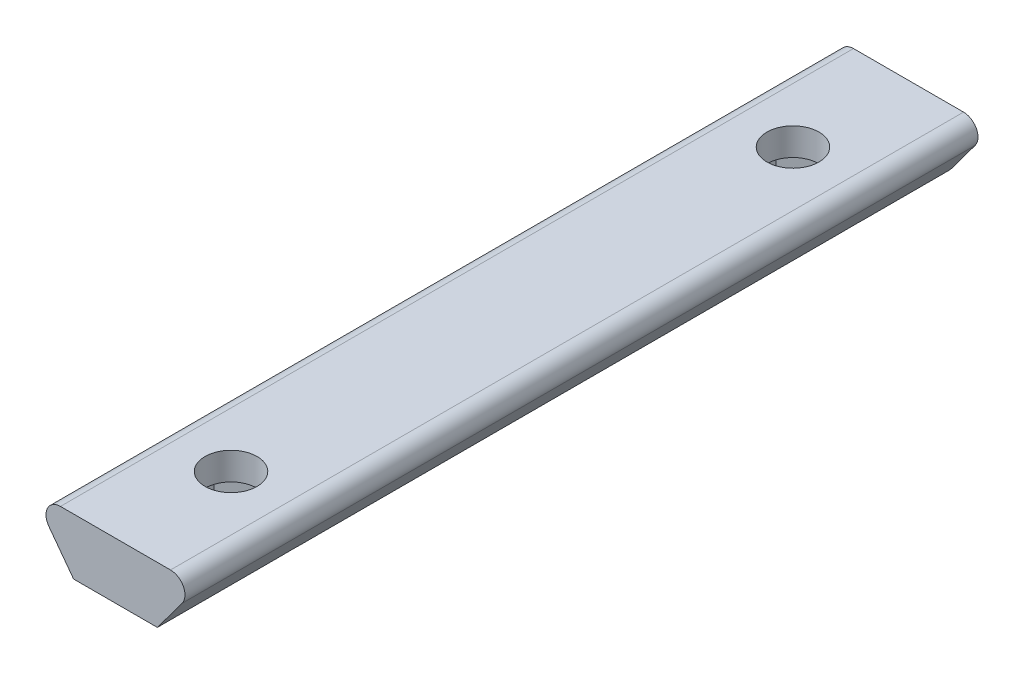
ISO-10303-21;
HEADER;
FILE_DESCRIPTION(('STEP AP214'),'2;1');
FILE_NAME('part.step','',(''),(''),'','','');
FILE_SCHEMA(('AUTOMOTIVE_DESIGN { 1 0 10303 214 1 1 1 1 }'));
ENDSEC;
DATA;
#1=APPLICATION_CONTEXT('core data for automotive mechanical design processes');
#2=APPLICATION_PROTOCOL_DEFINITION('international standard','automotive_design',2000,#1);
#3=PRODUCT_CONTEXT('',#1,'mechanical');
#4=PRODUCT('Part','Part','',(#3));
#5=PRODUCT_RELATED_PRODUCT_CATEGORY('part','',(#4));
#6=PRODUCT_DEFINITION_FORMATION('','',#4);
#7=PRODUCT_DEFINITION_CONTEXT('part definition',#1,'design');
#8=PRODUCT_DEFINITION('design','',#6,#7);
#9=PRODUCT_DEFINITION_SHAPE('','',#8);
#10=(LENGTH_UNIT() NAMED_UNIT(*) SI_UNIT(.MILLI.,.METRE.));
#11=(NAMED_UNIT(*) PLANE_ANGLE_UNIT() SI_UNIT($,.RADIAN.));
#12=(NAMED_UNIT(*) SI_UNIT($,.STERADIAN.) SOLID_ANGLE_UNIT());
#13=UNCERTAINTY_MEASURE_WITH_UNIT(LENGTH_MEASURE(1.E-05),#10,'distance_accuracy_value','');
#14=(GEOMETRIC_REPRESENTATION_CONTEXT(3) GLOBAL_UNCERTAINTY_ASSIGNED_CONTEXT((#13)) GLOBAL_UNIT_ASSIGNED_CONTEXT((#10,
#11,#12)) REPRESENTATION_CONTEXT('',''));
#15=CARTESIAN_POINT('',(0.,0.,0.));
#16=DIRECTION('',(0.,0.,1.));
#17=DIRECTION('',(1.,0.,0.));
#18=AXIS2_PLACEMENT_3D('',#15,#16,#17);
#19=CARTESIAN_POINT('',(0.,0.,54.9));
#20=DIRECTION('',(0.,1.,0.));
#21=DIRECTION('',(0.,0.,1.));
#22=AXIS2_PLACEMENT_3D('',#19,#20,#21);
#23=PLANE('',#22);
#24=DIRECTION('',(0.,0.,-1.));
#25=VECTOR('',#24,1.);
#26=CARTESIAN_POINT('',(0.,0.,54.9));
#27=LINE('',#26,#25);
#28=CARTESIAN_POINT('',(0.,0.,46.8828148717215));
#29=VERTEX_POINT('',#28);
#30=CARTESIAN_POINT('',(0.,0.,9.65148040349298));
#31=VERTEX_POINT('',#30);
#32=EDGE_CURVE('E334',#29,#31,#27,.T.);
#33=ORIENTED_EDGE('',*,*,#32,.T.);
#34=DIRECTION('',(-0.860038884376973,0.,-0.510228495244643));
#35=VECTOR('',#34,1.);
#36=CARTESIAN_POINT('',(2.86031403987544,0.,11.3483963860186));
#37=LINE('',#36,#35);
#38=CARTESIAN_POINT('',(2.86031403987544,0.,11.3483963860186));
#39=VERTEX_POINT('',#38);
#40=EDGE_CURVE('E210',#39,#31,#37,.T.);
#41=ORIENTED_EDGE('',*,*,#40,.F.);
#42=DIRECTION('',(-0.871890280805055,0.,0.489701274490564));
#43=VECTOR('',#42,1.);
#44=CARTESIAN_POINT('',(5.77995335216983,0.,9.70856724265073));
#45=LINE('',#44,#43);
#46=CARTESIAN_POINT('',(5.77995335216983,0.,9.70856724265073));
#47=VERTEX_POINT('',#46);
#48=EDGE_CURVE('E224',#47,#39,#45,.T.);
#49=ORIENTED_EDGE('',*,*,#48,.F.);
#50=DIRECTION('',(-0.0118513964280827,0.,0.999929769735207));
#51=VECTOR('',#50,1.);
#52=CARTESIAN_POINT('',(5.81963931229438,0.,6.36017085663215));
#53=LINE('',#52,#51);
#54=CARTESIAN_POINT('',(5.79999999999996,0.,8.0171851282863));
#55=VERTEX_POINT('',#54);
#56=EDGE_CURVE('E222',#55,#47,#53,.T.);
#57=ORIENTED_EDGE('',*,*,#56,.F.);
#58=DIRECTION('',(0.,0.,-1.));
#59=VECTOR('',#58,1.);
#60=CARTESIAN_POINT('',(5.8,0.,54.9));
#61=LINE('',#60,#59);
#62=CARTESIAN_POINT('',(5.8,0.,45.248519596507));
#63=VERTEX_POINT('',#62);
#64=EDGE_CURVE('E329',#63,#55,#61,.T.);
#65=ORIENTED_EDGE('',*,*,#64,.F.);
#66=DIRECTION('',(0.860038884376972,0.,0.510228495244643));
#67=VECTOR('',#66,1.);
#68=CARTESIAN_POINT('',(2.93968596012455,0.,43.5516036139814));
#69=LINE('',#68,#67);
#70=CARTESIAN_POINT('',(2.93968596012455,0.,43.5516036139814));
#71=VERTEX_POINT('',#70);
#72=EDGE_CURVE('E57',#71,#63,#69,.T.);
#73=ORIENTED_EDGE('',*,*,#72,.F.);
#74=DIRECTION('',(0.871890280805054,0.,-0.489701274490565));
#75=VECTOR('',#74,1.);
#76=CARTESIAN_POINT('',(0.0200466478301792,0.,45.1914327573493));
#77=LINE('',#76,#75);
#78=CARTESIAN_POINT('',(0.0200466478301792,0.,45.1914327573493));
#79=VERTEX_POINT('',#78);
#80=EDGE_CURVE('E267',#79,#71,#77,.T.);
#81=ORIENTED_EDGE('',*,*,#80,.F.);
#82=DIRECTION('',(0.0118513964280826,0.,-0.999929769735207));
#83=VECTOR('',#82,1.);
#84=CARTESIAN_POINT('',(-0.0196393122943744,0.,48.5398291433679));
#85=LINE('',#84,#83);
#86=EDGE_CURVE('E251',#29,#79,#85,.T.);
#87=ORIENTED_EDGE('',*,*,#86,.F.);
#88=EDGE_LOOP('',(#33,#41,#49,#57,#65,#73,#81,#87));
#89=FACE_BOUND('',#88,.T.);
#90=ADVANCED_FACE('F34',(#89),#23,.F.);
#91=CARTESIAN_POINT('',(2.9,200.,8.));
#92=DIRECTION('',(0.,-1.,0.));
#93=DIRECTION('',(0.,0.,-1.));
#94=AXIS2_PLACEMENT_3D('',#91,#92,#93);
#95=CYLINDRICAL_SURFACE('',#94,1.8);
#96=CARTESIAN_POINT('',(2.9,3.89999999999999,8.));
#97=DIRECTION('',(0.,-1.,0.));
#98=DIRECTION('',(0.,0.,-1.));
#99=AXIS2_PLACEMENT_3D('',#96,#97,#98);
#100=CIRCLE('',#99,1.8);
#101=CARTESIAN_POINT('',(2.9,3.89999999999999,6.2));
#102=VERTEX_POINT('',#101);
#103=EDGE_CURVE('E246',#102,#102,#100,.T.);
#104=ORIENTED_EDGE('',*,*,#103,.F.);
#105=EDGE_LOOP('',(#104));
#106=FACE_BOUND('',#105,.T.);
#107=CARTESIAN_POINT('',(2.9,2.,8.));
#108=DIRECTION('',(0.,-1.,0.));
#109=DIRECTION('',(0.,0.,-1.));
#110=AXIS2_PLACEMENT_3D('',#107,#108,#109);
#111=CIRCLE('',#110,1.8);
#112=CARTESIAN_POINT('',(2.9,2.,6.2));
#113=VERTEX_POINT('',#112);
#114=EDGE_CURVE('E230',#113,#113,#111,.F.);
#115=ORIENTED_EDGE('',*,*,#114,.F.);
#116=EDGE_LOOP('',(#115));
#117=FACE_BOUND('',#116,.T.);
#118=ADVANCED_FACE('F407',(#106,#117),#95,.F.);
#119=CARTESIAN_POINT('',(0.,0.,54.9));
#120=VERTEX_POINT('',#119);
#121=CARTESIAN_POINT('',(0.,0.,48.551480403493));
#122=VERTEX_POINT('',#121);
#123=EDGE_CURVE('E330',#120,#122,#27,.T.);
#124=ORIENTED_EDGE('',*,*,#123,.T.);
#125=DIRECTION('',(-0.860038884376973,0.,-0.510228495244643));
#126=VECTOR('',#125,1.);
#127=CARTESIAN_POINT('',(2.86031403987544,0.,50.2483963860186));
#128=LINE('',#127,#126);
#129=CARTESIAN_POINT('',(2.86031403987544,0.,50.2483963860186));
#130=VERTEX_POINT('',#129);
#131=EDGE_CURVE('E276',#130,#122,#128,.T.);
#132=ORIENTED_EDGE('',*,*,#131,.F.);
#133=DIRECTION('',(-0.871890280805055,0.,0.489701274490564));
#134=VECTOR('',#133,1.);
#135=CARTESIAN_POINT('',(5.77995335216983,0.,48.6085672426507));
#136=LINE('',#135,#134);
#137=CARTESIAN_POINT('',(5.77995335216983,0.,48.6085672426507));
#138=VERTEX_POINT('',#137);
#139=EDGE_CURVE('E273',#138,#130,#136,.T.);
#140=ORIENTED_EDGE('',*,*,#139,.F.);
#141=DIRECTION('',(-0.0118513964280827,0.,0.999929769735207));
#142=VECTOR('',#141,1.);
#143=CARTESIAN_POINT('',(5.81963931229438,0.,45.2601708566321));
#144=LINE('',#143,#142);
#145=CARTESIAN_POINT('',(5.80000000000003,0.,46.917185128274));
#146=VERTEX_POINT('',#145);
#147=EDGE_CURVE('E271',#146,#138,#144,.T.);
#148=ORIENTED_EDGE('',*,*,#147,.F.);
#149=CARTESIAN_POINT('',(5.8,0.,54.9));
#150=VERTEX_POINT('',#149);
#151=EDGE_CURVE('E325',#150,#146,#61,.T.);
#152=ORIENTED_EDGE('',*,*,#151,.F.);
#153=DIRECTION('',(1.,0.,0.));
#154=VECTOR('',#153,1.);
#155=CARTESIAN_POINT('',(0.,0.,54.9));
#156=LINE('',#155,#154);
#157=EDGE_CURVE('E304',#120,#150,#156,.T.);
#158=ORIENTED_EDGE('',*,*,#157,.F.);
#159=EDGE_LOOP('',(#124,#132,#140,#148,#152,#158));
#160=FACE_BOUND('',#159,.T.);
#161=ADVANCED_FACE('F409',(#160),#23,.F.);
#162=CARTESIAN_POINT('',(2.9,200.,46.9));
#163=DIRECTION('',(0.,-1.,0.));
#164=DIRECTION('',(0.,0.,-1.));
#165=AXIS2_PLACEMENT_3D('',#162,#163,#164);
#166=CYLINDRICAL_SURFACE('',#165,1.8);
#167=CARTESIAN_POINT('',(2.9,3.89999999999999,46.9));
#168=DIRECTION('',(0.,-1.,0.));
#169=DIRECTION('',(0.,0.,-1.));
#170=AXIS2_PLACEMENT_3D('',#167,#168,#169);
#171=CIRCLE('',#170,1.8);
#172=CARTESIAN_POINT('',(2.9,3.89999999999999,45.1));
#173=VERTEX_POINT('',#172);
#174=EDGE_CURVE('E301',#173,#173,#171,.T.);
#175=ORIENTED_EDGE('',*,*,#174,.F.);
#176=EDGE_LOOP('',(#175));
#177=FACE_BOUND('',#176,.T.);
#178=CARTESIAN_POINT('',(2.9,2.,46.9));
#179=DIRECTION('',(0.,-1.,0.));
#180=DIRECTION('',(0.,0.,-1.));
#181=AXIS2_PLACEMENT_3D('',#178,#179,#180);
#182=CIRCLE('',#181,1.8);
#183=CARTESIAN_POINT('',(2.9,2.,45.1));
#184=VERTEX_POINT('',#183);
#185=EDGE_CURVE('E282',#184,#184,#182,.F.);
#186=ORIENTED_EDGE('',*,*,#185,.F.);
#187=EDGE_LOOP('',(#186));
#188=FACE_BOUND('',#187,.T.);
#189=ADVANCED_FACE('F418',(#177,#188),#166,.F.);
#190=CARTESIAN_POINT('',(0.,0.,54.9));
#191=DIRECTION('',(0.802462340946133,0.596702766344561,0.));
#192=DIRECTION('',(-0.596702766344561,0.802462340946133,0.));
#193=AXIS2_PLACEMENT_3D('',#190,#191,#192);
#194=PLANE('',#193);
#195=CARTESIAN_POINT('',(0.,0.,7.98281487172149));
#196=VERTEX_POINT('',#195);
#197=CARTESIAN_POINT('',(0.,0.,0.));
#198=VERTEX_POINT('',#197);
#199=EDGE_CURVE('E328',#196,#198,#27,.T.);
#200=ORIENTED_EDGE('',*,*,#199,.F.);
#201=DIRECTION('',(-0.0118498914538362,0.0159360609206763,0.99980279157185));
#202=VECTOR('',#201,1.);
#203=CARTESIAN_POINT('',(-0.555853910391621,0.747527672595628,54.8814968959992));
#204=LINE('',#203,#202);
#205=CARTESIAN_POINT('',(-0.0196393122943727,0.026411488947599,9.63982914336786));
#206=VERTEX_POINT('',#205);
#207=EDGE_CURVE('E243',#196,#206,#204,.T.);
#208=ORIENTED_EDGE('',*,*,#207,.T.);
#209=DIRECTION('',(0.562497565518592,-0.756462243283624,0.333708500449065));
#210=VECTOR('',#209,1.);
#211=CARTESIAN_POINT('',(8.49360952720551,-11.4224403986557,14.6904172317982));
#212=LINE('',#211,#210);
#213=EDGE_CURVE('E240',#206,#31,#212,.T.);
#214=ORIENTED_EDGE('',*,*,#213,.T.);
#215=ORIENTED_EDGE('',*,*,#32,.F.);
#216=DIRECTION('',(-0.0118498914538362,0.0159360609206763,0.99980279157185));
#217=VECTOR('',#216,1.);
#218=CARTESIAN_POINT('',(-0.0949840381877716,0.127737154804245,54.896838198843));
#219=LINE('',#218,#217);
#220=CARTESIAN_POINT('',(-0.0196393122943739,0.0264114889476051,48.5398291433679));
#221=VERTEX_POINT('',#220);
#222=EDGE_CURVE('E298',#29,#221,#219,.T.);
#223=ORIENTED_EDGE('',*,*,#222,.T.);
#224=DIRECTION('',(0.562497565518592,-0.756462243283624,0.333708500449065));
#225=VECTOR('',#224,1.);
#226=CARTESIAN_POINT('',(1.19168200439215,-1.60260683349289,49.2584602005188));
#227=LINE('',#226,#225);
#228=EDGE_CURVE('E295',#221,#122,#227,.T.);
#229=ORIENTED_EDGE('',*,*,#228,.T.);
#230=ORIENTED_EDGE('',*,*,#123,.F.);
#231=DIRECTION('',(0.596702766344561,-0.802462340946133,0.));
#232=VECTOR('',#231,1.);
#233=CARTESIAN_POINT('',(0.,0.,54.9));
#234=LINE('',#233,#232);
#235=CARTESIAN_POINT('',(-1.71270819938481,2.30329723365544,54.9));
#236=VERTEX_POINT('',#235);
#237=EDGE_CURVE('E302',#236,#120,#234,.T.);
#238=ORIENTED_EDGE('',*,*,#237,.F.);
#239=DIRECTION('',(0.,0.,-1.));
#240=VECTOR('',#239,1.);
#241=CARTESIAN_POINT('',(-1.71270819938481,2.30329723365544,54.9));
#242=LINE('',#241,#240);
#243=CARTESIAN_POINT('',(-1.71270819938481,2.30329723365544,0.));
#244=VERTEX_POINT('',#243);
#245=EDGE_CURVE('E333',#236,#244,#242,.T.);
#246=ORIENTED_EDGE('',*,*,#245,.T.);
#247=DIRECTION('',(0.596702766344561,-0.802462340946133,0.));
#248=VECTOR('',#247,1.);
#249=CARTESIAN_POINT('',(0.,0.,0.));
#250=LINE('',#249,#248);
#251=EDGE_CURVE('E314',#244,#198,#250,.T.);
#252=ORIENTED_EDGE('',*,*,#251,.T.);
#253=EDGE_LOOP('',(#200,#208,#214,#215,#223,#229,#230,#238,#246,#252));
#254=FACE_BOUND('',#253,.T.);
#255=ADVANCED_FACE('F391',(#254),#194,.F.);
#256=DIRECTION('',(0.871890280805054,0.,-0.489701274490565));
#257=VECTOR('',#256,1.);
#258=CARTESIAN_POINT('',(0.0200466478301792,0.,6.29143275734927));
#259=LINE('',#258,#257);
#260=CARTESIAN_POINT('',(0.0200466478301792,0.,6.29143275734927));
#261=VERTEX_POINT('',#260);
#262=CARTESIAN_POINT('',(2.93968596012455,0.,4.65160361398141));
#263=VERTEX_POINT('',#262);
#264=EDGE_CURVE('E191',#261,#263,#259,.T.);
#265=ORIENTED_EDGE('',*,*,#264,.F.);
#266=DIRECTION('',(0.0118513964280826,0.,-0.999929769735207));
#267=VECTOR('',#266,1.);
#268=CARTESIAN_POINT('',(-0.0196393122943744,0.,9.63982914336786));
#269=LINE('',#268,#267);
#270=EDGE_CURVE('E208',#196,#261,#269,.T.);
#271=ORIENTED_EDGE('',*,*,#270,.F.);
#272=ORIENTED_EDGE('',*,*,#199,.T.);
#273=DIRECTION('',(1.,0.,0.));
#274=VECTOR('',#273,1.);
#275=CARTESIAN_POINT('',(0.,0.,0.));
#276=LINE('',#275,#274);
#277=CARTESIAN_POINT('',(5.8,0.,0.));
#278=VERTEX_POINT('',#277);
#279=EDGE_CURVE('E317',#198,#278,#276,.T.);
#280=ORIENTED_EDGE('',*,*,#279,.T.);
#281=CARTESIAN_POINT('',(5.8,0.,6.34851959650701));
#282=VERTEX_POINT('',#281);
#283=EDGE_CURVE('E313',#282,#278,#61,.T.);
#284=ORIENTED_EDGE('',*,*,#283,.F.);
#285=DIRECTION('',(0.860038884376972,0.,0.510228495244643));
#286=VECTOR('',#285,1.);
#287=CARTESIAN_POINT('',(2.93968596012455,0.,4.65160361398141));
#288=LINE('',#287,#286);
#289=EDGE_CURVE('E49',#263,#282,#288,.T.);
#290=ORIENTED_EDGE('',*,*,#289,.F.);
#291=EDGE_LOOP('',(#265,#271,#272,#280,#284,#290));
#292=FACE_BOUND('',#291,.T.);
#293=ADVANCED_FACE('F369',(#292),#23,.F.);
#294=CARTESIAN_POINT('',(5.8,0.,54.9));
#295=DIRECTION('',(-0.802462340946134,0.596702766344561,0.));
#296=DIRECTION('',(-0.596702766344561,-0.802462340946134,0.));
#297=AXIS2_PLACEMENT_3D('',#294,#295,#296);
#298=PLANE('',#297);
#299=ORIENTED_EDGE('',*,*,#64,.T.);
#300=DIRECTION('',(0.0118498914538363,0.0159360609206764,-0.99980279157185));
#301=VECTOR('',#300,1.);
#302=CARTESIAN_POINT('',(5.24455329309802,-0.746980054109557,54.8815104508711));
#303=LINE('',#302,#301);
#304=CARTESIAN_POINT('',(5.81963931229438,0.0264114889476216,6.36017085663214));
#305=VERTEX_POINT('',#304);
#306=EDGE_CURVE('E11',#55,#305,#303,.T.);
#307=ORIENTED_EDGE('',*,*,#306,.T.);
#308=DIRECTION('',(-0.562497565518592,-0.756462243283624,-0.333708500449065));
#309=VECTOR('',#308,1.);
#310=CARTESIAN_POINT('',(14.9136090239486,12.2562328253101,11.755278643112));
#311=LINE('',#310,#309);
#312=EDGE_CURVE('E42',#305,#282,#311,.T.);
#313=ORIENTED_EDGE('',*,*,#312,.T.);
#314=ORIENTED_EDGE('',*,*,#283,.T.);
#315=DIRECTION('',(0.596702766344561,0.802462340946133,0.));
#316=VECTOR('',#315,1.);
#317=CARTESIAN_POINT('',(5.8,0.,0.));
#318=LINE('',#317,#316);
#319=CARTESIAN_POINT('',(7.51270819938481,2.30329723365544,0.));
#320=VERTEX_POINT('',#319);
#321=EDGE_CURVE('E320',#278,#320,#318,.T.);
#322=ORIENTED_EDGE('',*,*,#321,.T.);
#323=DIRECTION('',(0.,0.,-1.));
#324=VECTOR('',#323,1.);
#325=CARTESIAN_POINT('',(7.51270819938481,2.30329723365544,54.9));
#326=LINE('',#325,#324);
#327=CARTESIAN_POINT('',(7.51270819938481,2.30329723365544,54.9));
#328=VERTEX_POINT('',#327);
#329=EDGE_CURVE('E350',#320,#328,#326,.F.);
#330=ORIENTED_EDGE('',*,*,#329,.T.);
#331=DIRECTION('',(0.596702766344561,0.802462340946133,0.));
#332=VECTOR('',#331,1.);
#333=CARTESIAN_POINT('',(5.8,0.,54.9));
#334=LINE('',#333,#332);
#335=EDGE_CURVE('E307',#150,#328,#334,.T.);
#336=ORIENTED_EDGE('',*,*,#335,.F.);
#337=ORIENTED_EDGE('',*,*,#151,.T.);
#338=DIRECTION('',(0.0118498914538363,0.0159360609206764,-0.99980279157185));
#339=VECTOR('',#338,1.);
#340=CARTESIAN_POINT('',(5.70542316530187,-0.127189536318168,54.8968517537148));
#341=LINE('',#340,#339);
#342=CARTESIAN_POINT('',(5.81963931229438,0.0264114889476168,45.2601708566321));
#343=VERTEX_POINT('',#342);
#344=EDGE_CURVE('E358',#146,#343,#341,.T.);
#345=ORIENTED_EDGE('',*,*,#344,.T.);
#346=DIRECTION('',(-0.562497565518592,-0.756462243283624,-0.333708500449065));
#347=VECTOR('',#346,1.);
#348=CARTESIAN_POINT('',(7.6116815011352,2.43639926014734,46.3233216118326));
#349=LINE('',#348,#347);
#350=EDGE_CURVE('E352',#343,#63,#349,.T.);
#351=ORIENTED_EDGE('',*,*,#350,.T.);
#352=EDGE_LOOP('',(#299,#307,#313,#314,#322,#330,#336,#337,#345,#351));
#353=FACE_BOUND('',#352,.T.);
#354=ADVANCED_FACE('F367',(#353),#298,.F.);
#355=CARTESIAN_POINT('',(-2.9,3.9,54.9));
#356=DIRECTION('',(0.,-1.,0.));
#357=DIRECTION('',(0.,0.,-1.));
#358=AXIS2_PLACEMENT_3D('',#355,#356,#357);
#359=PLANE('',#358);
#360=ORIENTED_EDGE('',*,*,#103,.T.);
#361=EDGE_LOOP('',(#360));
#362=FACE_BOUND('',#361,.T.);
#363=ORIENTED_EDGE('',*,*,#174,.T.);
#364=EDGE_LOOP('',(#363));
#365=FACE_BOUND('',#364,.T.);
#366=DIRECTION('',(-1.,0.,0.));
#367=VECTOR('',#366,1.);
#368=CARTESIAN_POINT('',(-2.9,3.9,0.));
#369=LINE('',#368,#367);
#370=CARTESIAN_POINT('',(6.71024585843868,3.9,0.));
#371=VERTEX_POINT('',#370);
#372=CARTESIAN_POINT('',(-0.91024585843868,3.9,0.));
#373=VERTEX_POINT('',#372);
#374=EDGE_CURVE('E305',#371,#373,#369,.T.);
#375=ORIENTED_EDGE('',*,*,#374,.T.);
#376=DIRECTION('',(0.,0.,-1.));
#377=VECTOR('',#376,1.);
#378=CARTESIAN_POINT('',(-0.91024585843868,3.9,54.9));
#379=LINE('',#378,#377);
#380=CARTESIAN_POINT('',(-0.91024585843868,3.9,54.9));
#381=VERTEX_POINT('',#380);
#382=EDGE_CURVE('E344',#373,#381,#379,.F.);
#383=ORIENTED_EDGE('',*,*,#382,.T.);
#384=DIRECTION('',(-1.,0.,0.));
#385=VECTOR('',#384,1.);
#386=CARTESIAN_POINT('',(-2.9,3.9,54.9));
#387=LINE('',#386,#385);
#388=CARTESIAN_POINT('',(6.71024585843868,3.9,54.9));
#389=VERTEX_POINT('',#388);
#390=EDGE_CURVE('E310',#389,#381,#387,.T.);
#391=ORIENTED_EDGE('',*,*,#390,.F.);
#392=DIRECTION('',(0.,0.,-1.));
#393=VECTOR('',#392,1.);
#394=CARTESIAN_POINT('',(6.71024585843868,3.9,54.9));
#395=LINE('',#394,#393);
#396=EDGE_CURVE('E341',#389,#371,#395,.T.);
#397=ORIENTED_EDGE('',*,*,#396,.T.);
#398=EDGE_LOOP('',(#375,#383,#391,#397));
#399=FACE_BOUND('',#398,.T.);
#400=ADVANCED_FACE('F425',(#362,#365,#399),#359,.F.);
#401=CARTESIAN_POINT('',(0.,0.,54.9));
#402=DIRECTION('',(0.,0.,-1.));
#403=DIRECTION('',(-1.,0.,0.));
#404=AXIS2_PLACEMENT_3D('',#401,#402,#403);
#405=PLANE('',#404);
#406=ORIENTED_EDGE('',*,*,#390,.T.);
#407=CARTESIAN_POINT('',(-0.91024585843868,2.9,54.9));
#408=DIRECTION('',(0.,0.,-1.));
#409=DIRECTION('',(-1.,0.,0.));
#410=AXIS2_PLACEMENT_3D('',#407,#408,#409);
#411=CIRCLE('',#410,1.);
#412=EDGE_CURVE('E348',#381,#236,#411,.F.);
#413=ORIENTED_EDGE('',*,*,#412,.T.);
#414=ORIENTED_EDGE('',*,*,#237,.T.);
#415=ORIENTED_EDGE('',*,*,#157,.T.);
#416=ORIENTED_EDGE('',*,*,#335,.T.);
#417=CARTESIAN_POINT('',(6.71024585843868,2.9,54.9));
#418=DIRECTION('',(0.,0.,-1.));
#419=DIRECTION('',(-1.,0.,0.));
#420=AXIS2_PLACEMENT_3D('',#417,#418,#419);
#421=CIRCLE('',#420,1.);
#422=EDGE_CURVE('E346',#328,#389,#421,.F.);
#423=ORIENTED_EDGE('',*,*,#422,.T.);
#424=EDGE_LOOP('',(#406,#413,#414,#415,#416,#423));
#425=FACE_BOUND('',#424,.T.);
#426=ADVANCED_FACE('F441',(#425),#405,.F.);
#427=CARTESIAN_POINT('',(0.,0.,0.));
#428=DIRECTION('',(0.,0.,-1.));
#429=DIRECTION('',(-1.,0.,0.));
#430=AXIS2_PLACEMENT_3D('',#427,#428,#429);
#431=PLANE('',#430);
#432=ORIENTED_EDGE('',*,*,#251,.F.);
#433=CARTESIAN_POINT('',(-0.91024585843868,2.9,0.));
#434=DIRECTION('',(0.,0.,-1.));
#435=DIRECTION('',(-1.,0.,0.));
#436=AXIS2_PLACEMENT_3D('',#433,#434,#435);
#437=CIRCLE('',#436,1.);
#438=EDGE_CURVE('E339',#244,#373,#437,.T.);
#439=ORIENTED_EDGE('',*,*,#438,.T.);
#440=ORIENTED_EDGE('',*,*,#374,.F.);
#441=CARTESIAN_POINT('',(6.71024585843868,2.9,0.));
#442=DIRECTION('',(0.,0.,-1.));
#443=DIRECTION('',(-1.,0.,0.));
#444=AXIS2_PLACEMENT_3D('',#441,#442,#443);
#445=CIRCLE('',#444,1.);
#446=EDGE_CURVE('E337',#371,#320,#445,.T.);
#447=ORIENTED_EDGE('',*,*,#446,.T.);
#448=ORIENTED_EDGE('',*,*,#321,.F.);
#449=ORIENTED_EDGE('',*,*,#279,.F.);
#450=EDGE_LOOP('',(#432,#439,#440,#447,#448,#449));
#451=FACE_BOUND('',#450,.T.);
#452=ADVANCED_FACE('F433',(#451),#431,.T.);
#453=CARTESIAN_POINT('',(-0.91024585843868,2.9,54.9));
#454=DIRECTION('',(0.,0.,-1.));
#455=DIRECTION('',(-1.,0.,0.));
#456=AXIS2_PLACEMENT_3D('',#453,#454,#455);
#457=CYLINDRICAL_SURFACE('',#456,1.);
#458=ORIENTED_EDGE('',*,*,#412,.F.);
#459=ORIENTED_EDGE('',*,*,#382,.F.);
#460=ORIENTED_EDGE('',*,*,#438,.F.);
#461=ORIENTED_EDGE('',*,*,#245,.F.);
#462=EDGE_LOOP('',(#458,#459,#460,#461));
#463=FACE_BOUND('',#462,.T.);
#464=ADVANCED_FACE('F431',(#463),#457,.T.);
#465=CARTESIAN_POINT('',(6.71024585843868,2.9,54.9));
#466=DIRECTION('',(0.,0.,-1.));
#467=DIRECTION('',(-1.,0.,0.));
#468=AXIS2_PLACEMENT_3D('',#465,#466,#467);
#469=CYLINDRICAL_SURFACE('',#468,1.);
#470=ORIENTED_EDGE('',*,*,#422,.F.);
#471=ORIENTED_EDGE('',*,*,#329,.F.);
#472=ORIENTED_EDGE('',*,*,#446,.F.);
#473=ORIENTED_EDGE('',*,*,#396,.F.);
#474=EDGE_LOOP('',(#470,#471,#472,#473));
#475=FACE_BOUND('',#474,.T.);
#476=ADVANCED_FACE('F36',(#475),#469,.T.);
#477=CARTESIAN_POINT('',(-0.0196393122943744,2.,48.5398291433679));
#478=DIRECTION('',(-0.999929769735207,0.,-0.0118513964280826));
#479=DIRECTION('',(-0.0118513964280826,0.,0.999929769735207));
#480=AXIS2_PLACEMENT_3D('',#477,#478,#479);
#481=PLANE('',#480);
#482=ORIENTED_EDGE('',*,*,#86,.T.);
#483=DIRECTION('',(0.,-1.,0.));
#484=VECTOR('',#483,1.);
#485=CARTESIAN_POINT('',(0.0200466478301792,2.,45.1914327573493));
#486=LINE('',#485,#484);
#487=CARTESIAN_POINT('',(0.0200466478301792,2.,45.1914327573493));
#488=VERTEX_POINT('',#487);
#489=EDGE_CURVE('E279',#488,#79,#486,.T.);
#490=ORIENTED_EDGE('',*,*,#489,.F.);
#491=DIRECTION('',(0.0118513964280826,0.,-0.999929769735207));
#492=VECTOR('',#491,1.);
#493=CARTESIAN_POINT('',(-0.0196393122943744,2.,48.5398291433679));
#494=LINE('',#493,#492);
#495=CARTESIAN_POINT('',(-0.0196393122943744,2.,48.5398291433679));
#496=VERTEX_POINT('',#495);
#497=EDGE_CURVE('E263',#496,#488,#494,.T.);
#498=ORIENTED_EDGE('',*,*,#497,.F.);
#499=DIRECTION('',(0.,-1.,0.));
#500=VECTOR('',#499,1.);
#501=CARTESIAN_POINT('',(-0.0196393122943744,2.,48.5398291433679));
#502=LINE('',#501,#500);
#503=EDGE_CURVE('E283',#496,#221,#502,.T.);
#504=ORIENTED_EDGE('',*,*,#503,.T.);
#505=ORIENTED_EDGE('',*,*,#222,.F.);
#506=EDGE_LOOP('',(#482,#490,#498,#504,#505));
#507=FACE_BOUND('',#506,.T.);
#508=ADVANCED_FACE('F439',(#507),#481,.F.);
#509=CARTESIAN_POINT('',(2.86031403987544,2.,50.2483963860186));
#510=DIRECTION('',(-0.510228495244643,0.,0.860038884376973));
#511=DIRECTION('',(0.860038884376973,0.,0.510228495244643));
#512=AXIS2_PLACEMENT_3D('',#509,#510,#511);
#513=PLANE('',#512);
#514=ORIENTED_EDGE('',*,*,#503,.F.);
#515=DIRECTION('',(-0.860038884376973,0.,-0.510228495244643));
#516=VECTOR('',#515,1.);
#517=CARTESIAN_POINT('',(2.86031403987544,2.,50.2483963860186));
#518=LINE('',#517,#516);
#519=CARTESIAN_POINT('',(2.86031403987544,2.,50.2483963860186));
#520=VERTEX_POINT('',#519);
#521=EDGE_CURVE('E260',#520,#496,#518,.T.);
#522=ORIENTED_EDGE('',*,*,#521,.F.);
#523=DIRECTION('',(0.,-1.,0.));
#524=VECTOR('',#523,1.);
#525=CARTESIAN_POINT('',(2.86031403987544,2.,50.2483963860186));
#526=LINE('',#525,#524);
#527=EDGE_CURVE('E286',#520,#130,#526,.T.);
#528=ORIENTED_EDGE('',*,*,#527,.T.);
#529=ORIENTED_EDGE('',*,*,#131,.T.);
#530=ORIENTED_EDGE('',*,*,#228,.F.);
#531=EDGE_LOOP('',(#514,#522,#528,#529,#530));
#532=FACE_BOUND('',#531,.T.);
#533=ADVANCED_FACE('F482',(#532),#513,.F.);
#534=CARTESIAN_POINT('',(5.81963931229438,2.,45.2601708566321));
#535=DIRECTION('',(0.999929769735207,0.,0.0118513964280827));
#536=DIRECTION('',(0.0118513964280827,0.,-0.999929769735207));
#537=AXIS2_PLACEMENT_3D('',#534,#535,#536);
#538=PLANE('',#537);
#539=ORIENTED_EDGE('',*,*,#147,.T.);
#540=DIRECTION('',(0.,-1.,0.));
#541=VECTOR('',#540,1.);
#542=CARTESIAN_POINT('',(5.77995335216983,2.,48.6085672426507));
#543=LINE('',#542,#541);
#544=CARTESIAN_POINT('',(5.77995335216983,2.,48.6085672426507));
#545=VERTEX_POINT('',#544);
#546=EDGE_CURVE('E288',#545,#138,#543,.T.);
#547=ORIENTED_EDGE('',*,*,#546,.F.);
#548=DIRECTION('',(-0.0118513964280827,0.,0.999929769735207));
#549=VECTOR('',#548,1.);
#550=CARTESIAN_POINT('',(5.81963931229438,2.,45.2601708566321));
#551=LINE('',#550,#549);
#552=CARTESIAN_POINT('',(5.81963931229438,2.,45.2601708566321));
#553=VERTEX_POINT('',#552);
#554=EDGE_CURVE('E254',#553,#545,#551,.T.);
#555=ORIENTED_EDGE('',*,*,#554,.F.);
#556=DIRECTION('',(0.,-1.,0.));
#557=VECTOR('',#556,1.);
#558=CARTESIAN_POINT('',(5.81963931229438,2.,45.2601708566321));
#559=LINE('',#558,#557);
#560=EDGE_CURVE('E291',#553,#343,#559,.T.);
#561=ORIENTED_EDGE('',*,*,#560,.T.);
#562=ORIENTED_EDGE('',*,*,#344,.F.);
#563=EDGE_LOOP('',(#539,#547,#555,#561,#562));
#564=FACE_BOUND('',#563,.T.);
#565=ADVANCED_FACE('F479',(#564),#538,.F.);
#566=CARTESIAN_POINT('',(2.93968596012455,2.,43.5516036139814));
#567=DIRECTION('',(0.510228495244643,0.,-0.860038884376972));
#568=DIRECTION('',(-0.860038884376972,0.,-0.510228495244643));
#569=AXIS2_PLACEMENT_3D('',#566,#567,#568);
#570=PLANE('',#569);
#571=ORIENTED_EDGE('',*,*,#560,.F.);
#572=DIRECTION('',(0.860038884376972,0.,0.510228495244643));
#573=VECTOR('',#572,1.);
#574=CARTESIAN_POINT('',(2.93968596012455,2.,43.5516036139814));
#575=LINE('',#574,#573);
#576=CARTESIAN_POINT('',(2.93968596012455,2.,43.5516036139814));
#577=VERTEX_POINT('',#576);
#578=EDGE_CURVE('E250',#577,#553,#575,.T.);
#579=ORIENTED_EDGE('',*,*,#578,.F.);
#580=DIRECTION('',(0.,-1.,0.));
#581=VECTOR('',#580,1.);
#582=CARTESIAN_POINT('',(2.93968596012455,2.,43.5516036139814));
#583=LINE('',#582,#581);
#584=EDGE_CURVE('E266',#577,#71,#583,.T.);
#585=ORIENTED_EDGE('',*,*,#584,.T.);
#586=ORIENTED_EDGE('',*,*,#72,.T.);
#587=ORIENTED_EDGE('',*,*,#350,.F.);
#588=EDGE_LOOP('',(#571,#579,#585,#586,#587));
#589=FACE_BOUND('',#588,.T.);
#590=ADVANCED_FACE('F476',(#589),#570,.F.);
#591=CARTESIAN_POINT('',(0.,2.,0.));
#592=DIRECTION('',(0.,-1.,0.));
#593=DIRECTION('',(0.,0.,-1.));
#594=AXIS2_PLACEMENT_3D('',#591,#592,#593);
#595=PLANE('',#594);
#596=DIRECTION('',(0.871890280805054,0.,-0.489701274490565));
#597=VECTOR('',#596,1.);
#598=CARTESIAN_POINT('',(0.0200466478301792,2.,45.1914327573493));
#599=LINE('',#598,#597);
#600=EDGE_CURVE('E247',#488,#577,#599,.T.);
#601=ORIENTED_EDGE('',*,*,#600,.T.);
#602=ORIENTED_EDGE('',*,*,#578,.T.);
#603=ORIENTED_EDGE('',*,*,#554,.T.);
#604=DIRECTION('',(-0.871890280805055,0.,0.489701274490564));
#605=VECTOR('',#604,1.);
#606=CARTESIAN_POINT('',(5.77995335216983,2.,48.6085672426507));
#607=LINE('',#606,#605);
#608=EDGE_CURVE('E257',#545,#520,#607,.T.);
#609=ORIENTED_EDGE('',*,*,#608,.T.);
#610=ORIENTED_EDGE('',*,*,#521,.T.);
#611=ORIENTED_EDGE('',*,*,#497,.T.);
#612=EDGE_LOOP('',(#601,#602,#603,#609,#610,#611));
#613=FACE_BOUND('',#612,.T.);
#614=ORIENTED_EDGE('',*,*,#185,.T.);
#615=EDGE_LOOP('',(#614));
#616=FACE_BOUND('',#615,.T.);
#617=ADVANCED_FACE('F474',(#613,#616),#595,.T.);
#618=CARTESIAN_POINT('',(0.0200466478301792,2.,45.1914327573493));
#619=DIRECTION('',(-0.489701274490565,0.,-0.871890280805054));
#620=DIRECTION('',(-0.871890280805054,0.,0.489701274490565));
#621=AXIS2_PLACEMENT_3D('',#618,#619,#620);
#622=PLANE('',#621);
#623=ORIENTED_EDGE('',*,*,#80,.T.);
#624=ORIENTED_EDGE('',*,*,#584,.F.);
#625=ORIENTED_EDGE('',*,*,#600,.F.);
#626=ORIENTED_EDGE('',*,*,#489,.T.);
#627=EDGE_LOOP('',(#623,#624,#625,#626));
#628=FACE_BOUND('',#627,.T.);
#629=ADVANCED_FACE('F471',(#628),#622,.F.);
#630=CARTESIAN_POINT('',(5.77995335216983,2.,48.6085672426507));
#631=DIRECTION('',(0.489701274490564,0.,0.871890280805055));
#632=DIRECTION('',(0.871890280805055,0.,-0.489701274490564));
#633=AXIS2_PLACEMENT_3D('',#630,#631,#632);
#634=PLANE('',#633);
#635=ORIENTED_EDGE('',*,*,#139,.T.);
#636=ORIENTED_EDGE('',*,*,#527,.F.);
#637=ORIENTED_EDGE('',*,*,#608,.F.);
#638=ORIENTED_EDGE('',*,*,#546,.T.);
#639=EDGE_LOOP('',(#635,#636,#637,#638));
#640=FACE_BOUND('',#639,.T.);
#641=ADVANCED_FACE('F403',(#640),#634,.F.);
#642=CARTESIAN_POINT('',(-0.0196393122943744,2.,9.63982914336786));
#643=DIRECTION('',(-0.999929769735207,0.,-0.0118513964280826));
#644=DIRECTION('',(-0.0118513964280826,0.,0.999929769735207));
#645=AXIS2_PLACEMENT_3D('',#642,#643,#644);
#646=PLANE('',#645);
#647=ORIENTED_EDGE('',*,*,#270,.T.);
#648=DIRECTION('',(0.,-1.,0.));
#649=VECTOR('',#648,1.);
#650=CARTESIAN_POINT('',(0.0200466478301792,2.,6.29143275734927));
#651=LINE('',#650,#649);
#652=CARTESIAN_POINT('',(0.0200466478301792,2.,6.29143275734927));
#653=VERTEX_POINT('',#652);
#654=EDGE_CURVE('E228',#653,#261,#651,.T.);
#655=ORIENTED_EDGE('',*,*,#654,.F.);
#656=DIRECTION('',(0.0118513964280826,0.,-0.999929769735207));
#657=VECTOR('',#656,1.);
#658=CARTESIAN_POINT('',(-0.0196393122943744,2.,9.63982914336786));
#659=LINE('',#658,#657);
#660=CARTESIAN_POINT('',(-0.0196393122943744,2.,9.63982914336786));
#661=VERTEX_POINT('',#660);
#662=EDGE_CURVE('E193',#661,#653,#659,.T.);
#663=ORIENTED_EDGE('',*,*,#662,.F.);
#664=DIRECTION('',(0.,-1.,0.));
#665=VECTOR('',#664,1.);
#666=CARTESIAN_POINT('',(-0.0196393122943744,2.,9.63982914336786));
#667=LINE('',#666,#665);
#668=EDGE_CURVE('E231',#661,#206,#667,.T.);
#669=ORIENTED_EDGE('',*,*,#668,.T.);
#670=ORIENTED_EDGE('',*,*,#207,.F.);
#671=EDGE_LOOP('',(#647,#655,#663,#669,#670));
#672=FACE_BOUND('',#671,.T.);
#673=ADVANCED_FACE('F387',(#672),#646,.F.);
#674=CARTESIAN_POINT('',(2.86031403987544,2.,11.3483963860186));
#675=DIRECTION('',(-0.510228495244643,0.,0.860038884376973));
#676=DIRECTION('',(0.860038884376973,0.,0.510228495244643));
#677=AXIS2_PLACEMENT_3D('',#674,#675,#676);
#678=PLANE('',#677);
#679=ORIENTED_EDGE('',*,*,#668,.F.);
#680=DIRECTION('',(-0.860038884376973,0.,-0.510228495244643));
#681=VECTOR('',#680,1.);
#682=CARTESIAN_POINT('',(2.86031403987544,2.,11.3483963860186));
#683=LINE('',#682,#681);
#684=CARTESIAN_POINT('',(2.86031403987544,2.,11.3483963860186));
#685=VERTEX_POINT('',#684);
#686=EDGE_CURVE('E217',#685,#661,#683,.T.);
#687=ORIENTED_EDGE('',*,*,#686,.F.);
#688=DIRECTION('',(0.,-1.,0.));
#689=VECTOR('',#688,1.);
#690=CARTESIAN_POINT('',(2.86031403987544,2.,11.3483963860186));
#691=LINE('',#690,#689);
#692=EDGE_CURVE('E234',#685,#39,#691,.T.);
#693=ORIENTED_EDGE('',*,*,#692,.T.);
#694=ORIENTED_EDGE('',*,*,#40,.T.);
#695=ORIENTED_EDGE('',*,*,#213,.F.);
#696=EDGE_LOOP('',(#679,#687,#693,#694,#695));
#697=FACE_BOUND('',#696,.T.);
#698=ADVANCED_FACE('F395',(#697),#678,.F.);
#699=CARTESIAN_POINT('',(5.81963931229438,2.,6.36017085663215));
#700=DIRECTION('',(0.999929769735207,0.,0.0118513964280827));
#701=DIRECTION('',(0.0118513964280827,0.,-0.999929769735207));
#702=AXIS2_PLACEMENT_3D('',#699,#700,#701);
#703=PLANE('',#702);
#704=ORIENTED_EDGE('',*,*,#56,.T.);
#705=DIRECTION('',(0.,-1.,0.));
#706=VECTOR('',#705,1.);
#707=CARTESIAN_POINT('',(5.77995335216983,2.,9.70856724265073));
#708=LINE('',#707,#706);
#709=CARTESIAN_POINT('',(5.77995335216983,2.,9.70856724265073));
#710=VERTEX_POINT('',#709);
#711=EDGE_CURVE('E236',#710,#47,#708,.T.);
#712=ORIENTED_EDGE('',*,*,#711,.F.);
#713=DIRECTION('',(-0.0118513964280827,0.,0.999929769735207));
#714=VECTOR('',#713,1.);
#715=CARTESIAN_POINT('',(5.81963931229438,2.,6.36017085663215));
#716=LINE('',#715,#714);
#717=CARTESIAN_POINT('',(5.81963931229438,2.,6.36017085663215));
#718=VERTEX_POINT('',#717);
#719=EDGE_CURVE('E202',#718,#710,#716,.T.);
#720=ORIENTED_EDGE('',*,*,#719,.F.);
#721=DIRECTION('',(0.,-1.,0.));
#722=VECTOR('',#721,1.);
#723=CARTESIAN_POINT('',(5.81963931229438,2.,6.36017085663215));
#724=LINE('',#723,#722);
#725=EDGE_CURVE('E192',#718,#305,#724,.T.);
#726=ORIENTED_EDGE('',*,*,#725,.T.);
#727=ORIENTED_EDGE('',*,*,#306,.F.);
#728=EDGE_LOOP('',(#704,#712,#720,#726,#727));
#729=FACE_BOUND('',#728,.T.);
#730=ADVANCED_FACE('F380',(#729),#703,.F.);
#731=CARTESIAN_POINT('',(2.93968596012455,2.,4.65160361398141));
#732=DIRECTION('',(0.510228495244643,0.,-0.860038884376972));
#733=DIRECTION('',(-0.860038884376972,0.,-0.510228495244643));
#734=AXIS2_PLACEMENT_3D('',#731,#732,#733);
#735=PLANE('',#734);
#736=ORIENTED_EDGE('',*,*,#725,.F.);
#737=DIRECTION('',(0.860038884376972,0.,0.510228495244643));
#738=VECTOR('',#737,1.);
#739=CARTESIAN_POINT('',(2.93968596012455,2.,4.65160361398141));
#740=LINE('',#739,#738);
#741=CARTESIAN_POINT('',(2.93968596012455,2.,4.65160361398141));
#742=VERTEX_POINT('',#741);
#743=EDGE_CURVE('E196',#742,#718,#740,.T.);
#744=ORIENTED_EDGE('',*,*,#743,.F.);
#745=DIRECTION('',(0.,-1.,0.));
#746=VECTOR('',#745,1.);
#747=CARTESIAN_POINT('',(2.93968596012455,2.,4.65160361398141));
#748=LINE('',#747,#746);
#749=EDGE_CURVE('E183',#742,#263,#748,.T.);
#750=ORIENTED_EDGE('',*,*,#749,.T.);
#751=ORIENTED_EDGE('',*,*,#289,.T.);
#752=ORIENTED_EDGE('',*,*,#312,.F.);
#753=EDGE_LOOP('',(#736,#744,#750,#751,#752));
#754=FACE_BOUND('',#753,.T.);
#755=ADVANCED_FACE('F197',(#754),#735,.F.);
#756=CARTESIAN_POINT('',(0.,2.,-38.9));
#757=DIRECTION('',(0.,-1.,0.));
#758=DIRECTION('',(0.,0.,-1.));
#759=AXIS2_PLACEMENT_3D('',#756,#757,#758);
#760=PLANE('',#759);
#761=DIRECTION('',(0.871890280805054,0.,-0.489701274490565));
#762=VECTOR('',#761,1.);
#763=CARTESIAN_POINT('',(0.0200466478301792,2.,6.29143275734927));
#764=LINE('',#763,#762);
#765=EDGE_CURVE('E188',#653,#742,#764,.T.);
#766=ORIENTED_EDGE('',*,*,#765,.T.);
#767=ORIENTED_EDGE('',*,*,#743,.T.);
#768=ORIENTED_EDGE('',*,*,#719,.T.);
#769=DIRECTION('',(-0.871890280805055,0.,0.489701274490564));
#770=VECTOR('',#769,1.);
#771=CARTESIAN_POINT('',(5.77995335216983,2.,9.70856724265073));
#772=LINE('',#771,#770);
#773=EDGE_CURVE('E214',#710,#685,#772,.T.);
#774=ORIENTED_EDGE('',*,*,#773,.T.);
#775=ORIENTED_EDGE('',*,*,#686,.T.);
#776=ORIENTED_EDGE('',*,*,#662,.T.);
#777=EDGE_LOOP('',(#766,#767,#768,#774,#775,#776));
#778=FACE_BOUND('',#777,.T.);
#779=ORIENTED_EDGE('',*,*,#114,.T.);
#780=EDGE_LOOP('',(#779));
#781=FACE_BOUND('',#780,.T.);
#782=ADVANCED_FACE('F204',(#778,#781),#760,.T.);
#783=CARTESIAN_POINT('',(0.0200466478301792,2.,6.29143275734927));
#784=DIRECTION('',(-0.489701274490565,0.,-0.871890280805054));
#785=DIRECTION('',(-0.871890280805054,0.,0.489701274490565));
#786=AXIS2_PLACEMENT_3D('',#783,#784,#785);
#787=PLANE('',#786);
#788=ORIENTED_EDGE('',*,*,#264,.T.);
#789=ORIENTED_EDGE('',*,*,#749,.F.);
#790=ORIENTED_EDGE('',*,*,#765,.F.);
#791=ORIENTED_EDGE('',*,*,#654,.T.);
#792=EDGE_LOOP('',(#788,#789,#790,#791));
#793=FACE_BOUND('',#792,.T.);
#794=ADVANCED_FACE('F185',(#793),#787,.F.);
#795=CARTESIAN_POINT('',(5.77995335216983,2.,9.70856724265073));
#796=DIRECTION('',(0.489701274490564,0.,0.871890280805055));
#797=DIRECTION('',(0.871890280805055,0.,-0.489701274490564));
#798=AXIS2_PLACEMENT_3D('',#795,#796,#797);
#799=PLANE('',#798);
#800=ORIENTED_EDGE('',*,*,#48,.T.);
#801=ORIENTED_EDGE('',*,*,#692,.F.);
#802=ORIENTED_EDGE('',*,*,#773,.F.);
#803=ORIENTED_EDGE('',*,*,#711,.T.);
#804=EDGE_LOOP('',(#800,#801,#802,#803));
#805=FACE_BOUND('',#804,.T.);
#806=ADVANCED_FACE('F383',(#805),#799,.F.);
#807=CLOSED_SHELL('',(#90,#118,#161,#189,#255,#293,#354,#400,#426,#452,#464,#476,#508,#533,#565,
#590,#617,#629,#641,#673,#698,#730,#755,#782,#794,#806));
#808=MANIFOLD_SOLID_BREP('B2',#807);
#809=ADVANCED_BREP_SHAPE_REPRESENTATION('',(#18,#808),#14);
#810=SHAPE_DEFINITION_REPRESENTATION(#9,#809);
ENDSEC;
END-ISO-10303-21;
